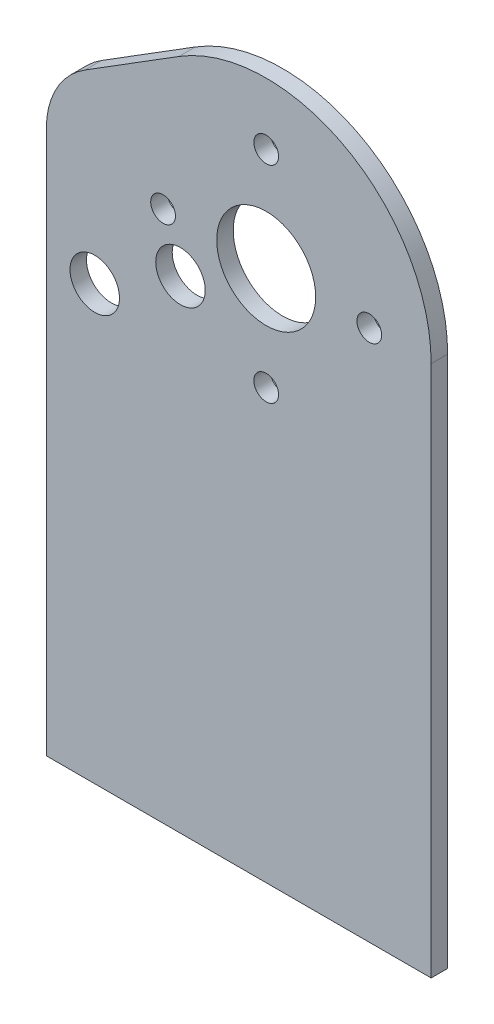
ISO-10303-21;
HEADER;
FILE_DESCRIPTION(('STEP AP214'),'2;1');
FILE_NAME('part.step','',(''),(''),'','','');
FILE_SCHEMA(('AUTOMOTIVE_DESIGN { 1 0 10303 214 1 1 1 1 }'));
ENDSEC;
DATA;
#1=APPLICATION_CONTEXT('core data for automotive mechanical design processes');
#2=APPLICATION_PROTOCOL_DEFINITION('international standard','automotive_design',2000,#1);
#3=PRODUCT_CONTEXT('',#1,'mechanical');
#4=PRODUCT('Part','Part','',(#3));
#5=PRODUCT_RELATED_PRODUCT_CATEGORY('part','',(#4));
#6=PRODUCT_DEFINITION_FORMATION('','',#4);
#7=PRODUCT_DEFINITION_CONTEXT('part definition',#1,'design');
#8=PRODUCT_DEFINITION('design','',#6,#7);
#9=PRODUCT_DEFINITION_SHAPE('','',#8);
#10=(LENGTH_UNIT() NAMED_UNIT(*) SI_UNIT(.MILLI.,.METRE.));
#11=(NAMED_UNIT(*) PLANE_ANGLE_UNIT() SI_UNIT($,.RADIAN.));
#12=(NAMED_UNIT(*) SI_UNIT($,.STERADIAN.) SOLID_ANGLE_UNIT());
#13=UNCERTAINTY_MEASURE_WITH_UNIT(LENGTH_MEASURE(1.E-05),#10,'distance_accuracy_value','');
#14=(GEOMETRIC_REPRESENTATION_CONTEXT(3) GLOBAL_UNCERTAINTY_ASSIGNED_CONTEXT((#13)) GLOBAL_UNIT_ASSIGNED_CONTEXT((#10,
#11,#12)) REPRESENTATION_CONTEXT('',''));
#15=CARTESIAN_POINT('',(0.,0.,0.));
#16=DIRECTION('',(0.,0.,1.));
#17=DIRECTION('',(1.,0.,0.));
#18=AXIS2_PLACEMENT_3D('',#15,#16,#17);
#19=CARTESIAN_POINT('',(0.,0.,2.));
#20=DIRECTION('',(0.,0.,-1.));
#21=DIRECTION('',(-1.,0.,0.));
#22=AXIS2_PLACEMENT_3D('',#19,#20,#21);
#23=CYLINDRICAL_SURFACE('',#22,20.);
#24=CARTESIAN_POINT('',(0.,0.,0.));
#25=DIRECTION('',(0.,0.,1.));
#26=DIRECTION('',(1.,0.,0.));
#27=AXIS2_PLACEMENT_3D('',#24,#25,#26);
#28=CIRCLE('',#27,20.);
#29=CARTESIAN_POINT('',(20.,0.,0.));
#30=VERTEX_POINT('',#29);
#31=CARTESIAN_POINT('',(-10.5980373391036,16.961179338683,0.));
#32=VERTEX_POINT('',#31);
#33=EDGE_CURVE('E115',#30,#32,#28,.T.);
#34=ORIENTED_EDGE('',*,*,#33,.T.);
#35=DIRECTION('',(0.,0.,-1.));
#36=VECTOR('',#35,1.);
#37=CARTESIAN_POINT('',(-10.5980373391036,16.961179338683,2.));
#38=LINE('',#37,#36);
#39=CARTESIAN_POINT('',(-10.5980373391036,16.961179338683,2.));
#40=VERTEX_POINT('',#39);
#41=EDGE_CURVE('E11',#40,#32,#38,.T.);
#42=ORIENTED_EDGE('',*,*,#41,.F.);
#43=CARTESIAN_POINT('',(0.,0.,2.));
#44=DIRECTION('',(0.,0.,1.));
#45=DIRECTION('',(1.,0.,0.));
#46=AXIS2_PLACEMENT_3D('',#43,#44,#45);
#47=CIRCLE('',#46,20.);
#48=CARTESIAN_POINT('',(20.,0.,2.));
#49=VERTEX_POINT('',#48);
#50=EDGE_CURVE('E126',#49,#40,#47,.T.);
#51=ORIENTED_EDGE('',*,*,#50,.F.);
#52=DIRECTION('',(0.,0.,-1.));
#53=VECTOR('',#52,1.);
#54=CARTESIAN_POINT('',(20.,0.,2.));
#55=LINE('',#54,#53);
#56=EDGE_CURVE('E111',#49,#30,#55,.T.);
#57=ORIENTED_EDGE('',*,*,#56,.T.);
#58=EDGE_LOOP('',(#34,#42,#51,#57));
#59=FACE_BOUND('',#58,.T.);
#60=ADVANCED_FACE('F31',(#59),#23,.T.);
#61=CARTESIAN_POINT('',(-10.5980373391036,16.961179338683,2.));
#62=DIRECTION('',(0.52990186695518,-0.848058966934149,0.));
#63=DIRECTION('',(0.848058966934148,0.52990186695518,0.));
#64=AXIS2_PLACEMENT_3D('',#61,#62,#63);
#65=PLANE('',#64);
#66=DIRECTION('',(-0.848058966934148,-0.52990186695518,0.));
#67=VECTOR('',#66,1.);
#68=CARTESIAN_POINT('',(-10.5980373391036,16.961179338683,0.));
#69=LINE('',#68,#67);
#70=CARTESIAN_POINT('',(-21.95053644451,9.86767439962256,0.));
#71=VERTEX_POINT('',#70);
#72=EDGE_CURVE('E118',#32,#71,#69,.T.);
#73=ORIENTED_EDGE('',*,*,#72,.T.);
#74=DIRECTION('',(0.,0.,-1.));
#75=VECTOR('',#74,1.);
#76=CARTESIAN_POINT('',(-21.95053644451,9.86767439962256,2.));
#77=LINE('',#76,#75);
#78=CARTESIAN_POINT('',(-21.95053644451,9.86767439962256,2.));
#79=VERTEX_POINT('',#78);
#80=EDGE_CURVE('E39',#79,#71,#77,.T.);
#81=ORIENTED_EDGE('',*,*,#80,.F.);
#82=DIRECTION('',(-0.848058966934148,-0.52990186695518,0.));
#83=VECTOR('',#82,1.);
#84=CARTESIAN_POINT('',(-10.5980373391036,16.961179338683,2.));
#85=LINE('',#84,#83);
#86=EDGE_CURVE('E84',#40,#79,#85,.T.);
#87=ORIENTED_EDGE('',*,*,#86,.F.);
#88=ORIENTED_EDGE('',*,*,#41,.T.);
#89=EDGE_LOOP('',(#73,#81,#87,#88));
#90=FACE_BOUND('',#89,.T.);
#91=ADVANCED_FACE('F151',(#90),#65,.F.);
#92=CARTESIAN_POINT('',(-16.6515177749582,1.38708473028106,2.));
#93=DIRECTION('',(0.,0.,-1.));
#94=DIRECTION('',(-1.,0.,0.));
#95=AXIS2_PLACEMENT_3D('',#92,#93,#94);
#96=CYLINDRICAL_SURFACE('',#95,10.);
#97=CARTESIAN_POINT('',(-16.6515177749582,1.38708473028106,0.));
#98=DIRECTION('',(0.,0.,1.));
#99=DIRECTION('',(1.,0.,0.));
#100=AXIS2_PLACEMENT_3D('',#97,#98,#99);
#101=CIRCLE('',#100,10.);
#102=CARTESIAN_POINT('',(-26.6515177749582,1.38708473028101,0.));
#103=VERTEX_POINT('',#102);
#104=EDGE_CURVE('E121',#71,#103,#101,.T.);
#105=ORIENTED_EDGE('',*,*,#104,.T.);
#106=DIRECTION('',(0.,0.,-1.));
#107=VECTOR('',#106,1.);
#108=CARTESIAN_POINT('',(-26.6515177749582,1.38708473028101,2.));
#109=LINE('',#108,#107);
#110=CARTESIAN_POINT('',(-26.6515177749582,1.38708473028101,2.));
#111=VERTEX_POINT('',#110);
#112=EDGE_CURVE('E106',#111,#103,#109,.T.);
#113=ORIENTED_EDGE('',*,*,#112,.F.);
#114=CARTESIAN_POINT('',(-16.6515177749582,1.38708473028106,2.));
#115=DIRECTION('',(0.,0.,1.));
#116=DIRECTION('',(1.,0.,0.));
#117=AXIS2_PLACEMENT_3D('',#114,#115,#116);
#118=CIRCLE('',#117,10.);
#119=EDGE_CURVE('E97',#79,#111,#118,.T.);
#120=ORIENTED_EDGE('',*,*,#119,.F.);
#121=ORIENTED_EDGE('',*,*,#80,.T.);
#122=EDGE_LOOP('',(#105,#113,#120,#121));
#123=FACE_BOUND('',#122,.T.);
#124=ADVANCED_FACE('F132',(#123),#96,.T.);
#125=CARTESIAN_POINT('',(-26.6515177749582,-64.4942630329588,2.));
#126=DIRECTION('',(1.,0.,0.));
#127=DIRECTION('',(0.,0.,-1.));
#128=AXIS2_PLACEMENT_3D('',#125,#126,#127);
#129=PLANE('',#128);
#130=DIRECTION('',(0.,-1.,0.));
#131=VECTOR('',#130,1.);
#132=CARTESIAN_POINT('',(-26.6515177749582,-64.4942630329588,0.));
#133=LINE('',#132,#131);
#134=CARTESIAN_POINT('',(-26.6515177749582,-64.4942630329588,0.));
#135=VERTEX_POINT('',#134);
#136=EDGE_CURVE('E105',#103,#135,#133,.T.);
#137=ORIENTED_EDGE('',*,*,#136,.T.);
#138=DIRECTION('',(0.,0.,-1.));
#139=VECTOR('',#138,1.);
#140=CARTESIAN_POINT('',(-26.6515177749582,-64.4942630329588,2.));
#141=LINE('',#140,#139);
#142=CARTESIAN_POINT('',(-26.6515177749582,-64.4942630329588,2.));
#143=VERTEX_POINT('',#142);
#144=EDGE_CURVE('E102',#143,#135,#141,.T.);
#145=ORIENTED_EDGE('',*,*,#144,.F.);
#146=DIRECTION('',(0.,-1.,0.));
#147=VECTOR('',#146,1.);
#148=CARTESIAN_POINT('',(-26.6515177749582,-64.4942630329588,2.));
#149=LINE('',#148,#147);
#150=EDGE_CURVE('E91',#111,#143,#149,.T.);
#151=ORIENTED_EDGE('',*,*,#150,.F.);
#152=ORIENTED_EDGE('',*,*,#112,.T.);
#153=EDGE_LOOP('',(#137,#145,#151,#152));
#154=FACE_BOUND('',#153,.T.);
#155=ADVANCED_FACE('F103',(#154),#129,.F.);
#156=CARTESIAN_POINT('',(-26.6515177749582,-64.4942630329588,2.));
#157=DIRECTION('',(0.,1.,0.));
#158=DIRECTION('',(0.,0.,1.));
#159=AXIS2_PLACEMENT_3D('',#156,#157,#158);
#160=PLANE('',#159);
#161=DIRECTION('',(1.,0.,0.));
#162=VECTOR('',#161,1.);
#163=CARTESIAN_POINT('',(-26.6515177749582,-64.4942630329588,0.));
#164=LINE('',#163,#162);
#165=CARTESIAN_POINT('',(20.,-64.4942630329588,0.));
#166=VERTEX_POINT('',#165);
#167=EDGE_CURVE('E70',#135,#166,#164,.T.);
#168=ORIENTED_EDGE('',*,*,#167,.T.);
#169=DIRECTION('',(0.,0.,-1.));
#170=VECTOR('',#169,1.);
#171=CARTESIAN_POINT('',(20.,-64.4942630329588,2.));
#172=LINE('',#171,#170);
#173=CARTESIAN_POINT('',(20.,-64.4942630329588,2.));
#174=VERTEX_POINT('',#173);
#175=EDGE_CURVE('E107',#174,#166,#172,.T.);
#176=ORIENTED_EDGE('',*,*,#175,.F.);
#177=DIRECTION('',(1.,0.,0.));
#178=VECTOR('',#177,1.);
#179=CARTESIAN_POINT('',(-26.6515177749582,-64.4942630329588,2.));
#180=LINE('',#179,#178);
#181=EDGE_CURVE('E95',#143,#174,#180,.T.);
#182=ORIENTED_EDGE('',*,*,#181,.F.);
#183=ORIENTED_EDGE('',*,*,#144,.T.);
#184=EDGE_LOOP('',(#168,#176,#182,#183));
#185=FACE_BOUND('',#184,.T.);
#186=ADVANCED_FACE('F109',(#185),#160,.F.);
#187=CARTESIAN_POINT('',(20.,-64.4942630329588,2.));
#188=DIRECTION('',(-1.,0.,0.));
#189=DIRECTION('',(0.,-1.,0.));
#190=AXIS2_PLACEMENT_3D('',#187,#188,#189);
#191=PLANE('',#190);
#192=DIRECTION('',(0.,1.,0.));
#193=VECTOR('',#192,1.);
#194=CARTESIAN_POINT('',(20.,-64.4942630329588,0.));
#195=LINE('',#194,#193);
#196=EDGE_CURVE('E76',#166,#30,#195,.T.);
#197=ORIENTED_EDGE('',*,*,#196,.T.);
#198=ORIENTED_EDGE('',*,*,#56,.F.);
#199=DIRECTION('',(0.,1.,0.));
#200=VECTOR('',#199,1.);
#201=CARTESIAN_POINT('',(20.,-64.4942630329588,2.));
#202=LINE('',#201,#200);
#203=EDGE_CURVE('E47',#174,#49,#202,.T.);
#204=ORIENTED_EDGE('',*,*,#203,.F.);
#205=ORIENTED_EDGE('',*,*,#175,.T.);
#206=EDGE_LOOP('',(#197,#198,#204,#205));
#207=FACE_BOUND('',#206,.T.);
#208=ADVANCED_FACE('F139',(#207),#191,.F.);
#209=CARTESIAN_POINT('',(0.,0.,2.));
#210=DIRECTION('',(0.,0.,1.));
#211=DIRECTION('',(1.,0.,0.));
#212=AXIS2_PLACEMENT_3D('',#209,#210,#211);
#213=PLANE('',#212);
#214=CARTESIAN_POINT('',(-20.7846096908265,-12.0000000000001,2.));
#215=DIRECTION('',(0.,0.,-1.));
#216=DIRECTION('',(-1.,0.,0.));
#217=AXIS2_PLACEMENT_3D('',#214,#215,#216);
#218=CIRCLE('',#217,3.);
#219=CARTESIAN_POINT('',(-23.7846096908265,-12.0000000000001,2.));
#220=VERTEX_POINT('',#219);
#221=EDGE_CURVE('E264',#220,#220,#218,.T.);
#222=ORIENTED_EDGE('',*,*,#221,.T.);
#223=EDGE_LOOP('',(#222));
#224=FACE_BOUND('',#223,.T.);
#225=CARTESIAN_POINT('',(-10.3923048454132,-6.00000000000005,2.));
#226=DIRECTION('',(0.,0.,-1.));
#227=DIRECTION('',(-1.,0.,0.));
#228=AXIS2_PLACEMENT_3D('',#225,#226,#227);
#229=CIRCLE('',#228,3.);
#230=CARTESIAN_POINT('',(-13.3923048454132,-6.00000000000005,2.));
#231=VERTEX_POINT('',#230);
#232=EDGE_CURVE('E272',#231,#231,#229,.T.);
#233=ORIENTED_EDGE('',*,*,#232,.T.);
#234=EDGE_LOOP('',(#233));
#235=FACE_BOUND('',#234,.T.);
#236=CARTESIAN_POINT('',(1.30930626041602E-13,12.5,2.));
#237=DIRECTION('',(0.,0.,1.));
#238=DIRECTION('',(1.,0.,0.));
#239=AXIS2_PLACEMENT_3D('',#236,#237,#238);
#240=CIRCLE('',#239,1.5);
#241=CARTESIAN_POINT('',(1.50000000000013,12.5,2.));
#242=VERTEX_POINT('',#241);
#243=EDGE_CURVE('E275',#242,#242,#240,.T.);
#244=ORIENTED_EDGE('',*,*,#243,.F.);
#245=EDGE_LOOP('',(#244));
#246=FACE_BOUND('',#245,.T.);
#247=CARTESIAN_POINT('',(-12.5,0.,2.));
#248=DIRECTION('',(0.,0.,1.));
#249=DIRECTION('',(1.,0.,0.));
#250=AXIS2_PLACEMENT_3D('',#247,#248,#249);
#251=CIRCLE('',#250,1.5);
#252=CARTESIAN_POINT('',(-11.,0.,2.));
#253=VERTEX_POINT('',#252);
#254=EDGE_CURVE('E281',#253,#253,#251,.T.);
#255=ORIENTED_EDGE('',*,*,#254,.F.);
#256=EDGE_LOOP('',(#255));
#257=FACE_BOUND('',#256,.T.);
#258=CARTESIAN_POINT('',(0.,-12.5,2.));
#259=DIRECTION('',(0.,0.,1.));
#260=DIRECTION('',(1.,0.,0.));
#261=AXIS2_PLACEMENT_3D('',#258,#259,#260);
#262=CIRCLE('',#261,1.5);
#263=CARTESIAN_POINT('',(1.49999999999996,-12.5,2.));
#264=VERTEX_POINT('',#263);
#265=EDGE_CURVE('E287',#264,#264,#262,.T.);
#266=ORIENTED_EDGE('',*,*,#265,.F.);
#267=EDGE_LOOP('',(#266));
#268=FACE_BOUND('',#267,.T.);
#269=CARTESIAN_POINT('',(12.5,0.,2.));
#270=DIRECTION('',(0.,0.,1.));
#271=DIRECTION('',(1.,0.,0.));
#272=AXIS2_PLACEMENT_3D('',#269,#270,#271);
#273=CIRCLE('',#272,1.5);
#274=CARTESIAN_POINT('',(14.,0.,2.));
#275=VERTEX_POINT('',#274);
#276=EDGE_CURVE('E293',#275,#275,#273,.T.);
#277=ORIENTED_EDGE('',*,*,#276,.F.);
#278=EDGE_LOOP('',(#277));
#279=FACE_BOUND('',#278,.T.);
#280=CARTESIAN_POINT('',(0.,0.,2.));
#281=DIRECTION('',(0.,0.,1.));
#282=DIRECTION('',(1.,0.,0.));
#283=AXIS2_PLACEMENT_3D('',#280,#281,#282);
#284=CIRCLE('',#283,6.);
#285=CARTESIAN_POINT('',(6.,0.,2.));
#286=VERTEX_POINT('',#285);
#287=EDGE_CURVE('E299',#286,#286,#284,.T.);
#288=ORIENTED_EDGE('',*,*,#287,.F.);
#289=EDGE_LOOP('',(#288));
#290=FACE_BOUND('',#289,.T.);
#291=ORIENTED_EDGE('',*,*,#50,.T.);
#292=ORIENTED_EDGE('',*,*,#86,.T.);
#293=ORIENTED_EDGE('',*,*,#119,.T.);
#294=ORIENTED_EDGE('',*,*,#150,.T.);
#295=ORIENTED_EDGE('',*,*,#181,.T.);
#296=ORIENTED_EDGE('',*,*,#203,.T.);
#297=EDGE_LOOP('',(#291,#292,#293,#294,#295,#296));
#298=FACE_BOUND('',#297,.T.);
#299=ADVANCED_FACE('F93',(#224,#235,#246,#257,#268,#279,#290,#298),#213,.T.);
#300=CARTESIAN_POINT('',(0.,0.,0.));
#301=DIRECTION('',(0.,0.,1.));
#302=DIRECTION('',(1.,0.,0.));
#303=AXIS2_PLACEMENT_3D('',#300,#301,#302);
#304=PLANE('',#303);
#305=CARTESIAN_POINT('',(-20.7846096908265,-12.0000000000001,0.));
#306=DIRECTION('',(0.,0.,-1.));
#307=DIRECTION('',(-1.,0.,0.));
#308=AXIS2_PLACEMENT_3D('',#305,#306,#307);
#309=CIRCLE('',#308,3.);
#310=CARTESIAN_POINT('',(-23.7846096908265,-12.0000000000001,0.));
#311=VERTEX_POINT('',#310);
#312=EDGE_CURVE('E267',#311,#311,#309,.T.);
#313=ORIENTED_EDGE('',*,*,#312,.F.);
#314=EDGE_LOOP('',(#313));
#315=FACE_BOUND('',#314,.T.);
#316=CARTESIAN_POINT('',(-10.3923048454132,-6.00000000000005,0.));
#317=DIRECTION('',(0.,0.,-1.));
#318=DIRECTION('',(-1.,0.,0.));
#319=AXIS2_PLACEMENT_3D('',#316,#317,#318);
#320=CIRCLE('',#319,3.);
#321=CARTESIAN_POINT('',(-13.3923048454132,-6.00000000000005,0.));
#322=VERTEX_POINT('',#321);
#323=EDGE_CURVE('E269',#322,#322,#320,.T.);
#324=ORIENTED_EDGE('',*,*,#323,.F.);
#325=EDGE_LOOP('',(#324));
#326=FACE_BOUND('',#325,.T.);
#327=CARTESIAN_POINT('',(1.30930626041602E-13,12.5,0.));
#328=DIRECTION('',(0.,0.,1.));
#329=DIRECTION('',(1.,0.,0.));
#330=AXIS2_PLACEMENT_3D('',#327,#328,#329);
#331=CIRCLE('',#330,1.5);
#332=CARTESIAN_POINT('',(1.50000000000013,12.5,0.));
#333=VERTEX_POINT('',#332);
#334=EDGE_CURVE('E278',#333,#333,#331,.T.);
#335=ORIENTED_EDGE('',*,*,#334,.T.);
#336=EDGE_LOOP('',(#335));
#337=FACE_BOUND('',#336,.T.);
#338=CARTESIAN_POINT('',(-12.5,0.,0.));
#339=DIRECTION('',(0.,0.,1.));
#340=DIRECTION('',(1.,0.,0.));
#341=AXIS2_PLACEMENT_3D('',#338,#339,#340);
#342=CIRCLE('',#341,1.5);
#343=CARTESIAN_POINT('',(-11.,0.,0.));
#344=VERTEX_POINT('',#343);
#345=EDGE_CURVE('E284',#344,#344,#342,.T.);
#346=ORIENTED_EDGE('',*,*,#345,.T.);
#347=EDGE_LOOP('',(#346));
#348=FACE_BOUND('',#347,.T.);
#349=CARTESIAN_POINT('',(0.,-12.5,0.));
#350=DIRECTION('',(0.,0.,1.));
#351=DIRECTION('',(1.,0.,0.));
#352=AXIS2_PLACEMENT_3D('',#349,#350,#351);
#353=CIRCLE('',#352,1.5);
#354=CARTESIAN_POINT('',(1.49999999999996,-12.5,0.));
#355=VERTEX_POINT('',#354);
#356=EDGE_CURVE('E290',#355,#355,#353,.T.);
#357=ORIENTED_EDGE('',*,*,#356,.T.);
#358=EDGE_LOOP('',(#357));
#359=FACE_BOUND('',#358,.T.);
#360=CARTESIAN_POINT('',(12.5,0.,0.));
#361=DIRECTION('',(0.,0.,1.));
#362=DIRECTION('',(1.,0.,0.));
#363=AXIS2_PLACEMENT_3D('',#360,#361,#362);
#364=CIRCLE('',#363,1.5);
#365=CARTESIAN_POINT('',(14.,0.,0.));
#366=VERTEX_POINT('',#365);
#367=EDGE_CURVE('E296',#366,#366,#364,.T.);
#368=ORIENTED_EDGE('',*,*,#367,.T.);
#369=EDGE_LOOP('',(#368));
#370=FACE_BOUND('',#369,.T.);
#371=CARTESIAN_POINT('',(0.,0.,0.));
#372=DIRECTION('',(0.,0.,1.));
#373=DIRECTION('',(1.,0.,0.));
#374=AXIS2_PLACEMENT_3D('',#371,#372,#373);
#375=CIRCLE('',#374,6.);
#376=CARTESIAN_POINT('',(6.,0.,0.));
#377=VERTEX_POINT('',#376);
#378=EDGE_CURVE('E119',#377,#377,#375,.T.);
#379=ORIENTED_EDGE('',*,*,#378,.T.);
#380=EDGE_LOOP('',(#379));
#381=FACE_BOUND('',#380,.T.);
#382=ORIENTED_EDGE('',*,*,#33,.F.);
#383=ORIENTED_EDGE('',*,*,#196,.F.);
#384=ORIENTED_EDGE('',*,*,#167,.F.);
#385=ORIENTED_EDGE('',*,*,#136,.F.);
#386=ORIENTED_EDGE('',*,*,#104,.F.);
#387=ORIENTED_EDGE('',*,*,#72,.F.);
#388=EDGE_LOOP('',(#382,#383,#384,#385,#386,#387));
#389=FACE_BOUND('',#388,.T.);
#390=ADVANCED_FACE('F135',(#315,#326,#337,#348,#359,#370,#381,#389),#304,.F.);
#391=CARTESIAN_POINT('',(0.,0.,0.));
#392=DIRECTION('',(0.,0.,1.));
#393=DIRECTION('',(1.,0.,0.));
#394=AXIS2_PLACEMENT_3D('',#391,#392,#393);
#395=CYLINDRICAL_SURFACE('',#394,6.);
#396=ORIENTED_EDGE('',*,*,#378,.F.);
#397=EDGE_LOOP('',(#396));
#398=FACE_BOUND('',#397,.T.);
#399=ORIENTED_EDGE('',*,*,#287,.T.);
#400=EDGE_LOOP('',(#399));
#401=FACE_BOUND('',#400,.T.);
#402=ADVANCED_FACE('F179',(#398,#401),#395,.F.);
#403=CARTESIAN_POINT('',(12.5,0.,0.));
#404=DIRECTION('',(0.,0.,1.));
#405=DIRECTION('',(1.,0.,0.));
#406=AXIS2_PLACEMENT_3D('',#403,#404,#405);
#407=CYLINDRICAL_SURFACE('',#406,1.5);
#408=ORIENTED_EDGE('',*,*,#367,.F.);
#409=EDGE_LOOP('',(#408));
#410=FACE_BOUND('',#409,.T.);
#411=ORIENTED_EDGE('',*,*,#276,.T.);
#412=EDGE_LOOP('',(#411));
#413=FACE_BOUND('',#412,.T.);
#414=ADVANCED_FACE('F184',(#410,#413),#407,.F.);
#415=CARTESIAN_POINT('',(0.,-12.5,0.));
#416=DIRECTION('',(0.,0.,1.));
#417=DIRECTION('',(1.,0.,0.));
#418=AXIS2_PLACEMENT_3D('',#415,#416,#417);
#419=CYLINDRICAL_SURFACE('',#418,1.5);
#420=ORIENTED_EDGE('',*,*,#356,.F.);
#421=EDGE_LOOP('',(#420));
#422=FACE_BOUND('',#421,.T.);
#423=ORIENTED_EDGE('',*,*,#265,.T.);
#424=EDGE_LOOP('',(#423));
#425=FACE_BOUND('',#424,.T.);
#426=ADVANCED_FACE('F196',(#422,#425),#419,.F.);
#427=CARTESIAN_POINT('',(-12.5,0.,0.));
#428=DIRECTION('',(0.,0.,1.));
#429=DIRECTION('',(1.,0.,0.));
#430=AXIS2_PLACEMENT_3D('',#427,#428,#429);
#431=CYLINDRICAL_SURFACE('',#430,1.5);
#432=ORIENTED_EDGE('',*,*,#345,.F.);
#433=EDGE_LOOP('',(#432));
#434=FACE_BOUND('',#433,.T.);
#435=ORIENTED_EDGE('',*,*,#254,.T.);
#436=EDGE_LOOP('',(#435));
#437=FACE_BOUND('',#436,.T.);
#438=ADVANCED_FACE('F206',(#434,#437),#431,.F.);
#439=CARTESIAN_POINT('',(1.30930626041602E-13,12.5,0.));
#440=DIRECTION('',(0.,0.,1.));
#441=DIRECTION('',(1.,0.,0.));
#442=AXIS2_PLACEMENT_3D('',#439,#440,#441);
#443=CYLINDRICAL_SURFACE('',#442,1.5);
#444=ORIENTED_EDGE('',*,*,#334,.F.);
#445=EDGE_LOOP('',(#444));
#446=FACE_BOUND('',#445,.T.);
#447=ORIENTED_EDGE('',*,*,#243,.T.);
#448=EDGE_LOOP('',(#447));
#449=FACE_BOUND('',#448,.T.);
#450=ADVANCED_FACE('F216',(#446,#449),#443,.F.);
#451=CARTESIAN_POINT('',(-10.3923048454132,-6.00000000000005,2.));
#452=DIRECTION('',(0.,0.,-1.));
#453=DIRECTION('',(-1.,0.,0.));
#454=AXIS2_PLACEMENT_3D('',#451,#452,#453);
#455=CYLINDRICAL_SURFACE('',#454,3.);
#456=ORIENTED_EDGE('',*,*,#232,.F.);
#457=EDGE_LOOP('',(#456));
#458=FACE_BOUND('',#457,.T.);
#459=ORIENTED_EDGE('',*,*,#323,.T.);
#460=EDGE_LOOP('',(#459));
#461=FACE_BOUND('',#460,.T.);
#462=ADVANCED_FACE('F226',(#458,#461),#455,.F.);
#463=CARTESIAN_POINT('',(-20.7846096908265,-12.0000000000001,2.));
#464=DIRECTION('',(0.,0.,-1.));
#465=DIRECTION('',(-1.,0.,0.));
#466=AXIS2_PLACEMENT_3D('',#463,#464,#465);
#467=CYLINDRICAL_SURFACE('',#466,3.);
#468=ORIENTED_EDGE('',*,*,#221,.F.);
#469=EDGE_LOOP('',(#468));
#470=FACE_BOUND('',#469,.T.);
#471=ORIENTED_EDGE('',*,*,#312,.T.);
#472=EDGE_LOOP('',(#471));
#473=FACE_BOUND('',#472,.T.);
#474=ADVANCED_FACE('F247',(#470,#473),#467,.F.);
#475=CLOSED_SHELL('',(#60,#91,#124,#155,#186,#208,#299,#390,#402,#414,#426,#438,#450,#462,#474));
#476=MANIFOLD_SOLID_BREP('B2',#475);
#477=ADVANCED_BREP_SHAPE_REPRESENTATION('',(#18,#476),#14);
#478=SHAPE_DEFINITION_REPRESENTATION(#9,#477);
ENDSEC;
END-ISO-10303-21;
